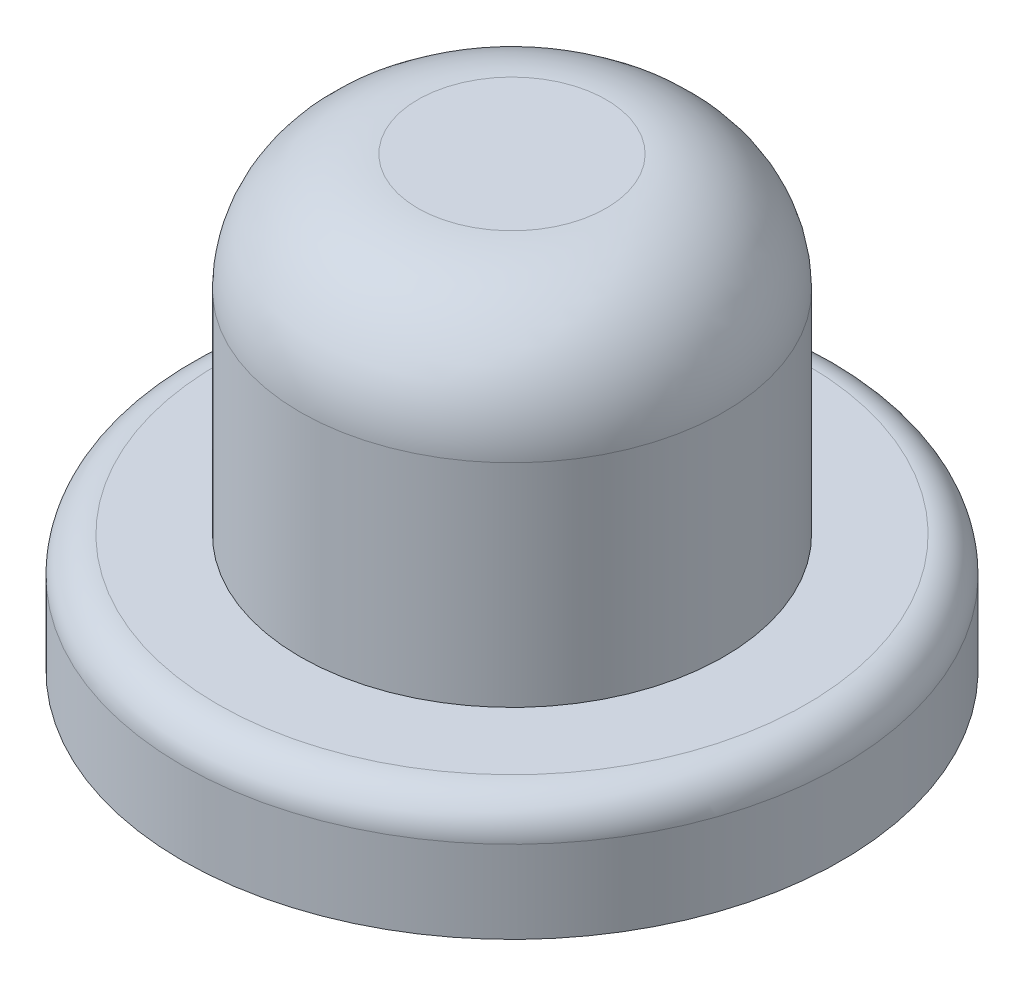
ISO-10303-21;
HEADER;
FILE_DESCRIPTION(('STEP AP214'),'2;1');
FILE_NAME('part.step','',(''),(''),'','','');
FILE_SCHEMA(('AUTOMOTIVE_DESIGN { 1 0 10303 214 1 1 1 1 }'));
ENDSEC;
DATA;
#1=APPLICATION_CONTEXT('core data for automotive mechanical design processes');
#2=APPLICATION_PROTOCOL_DEFINITION('international standard','automotive_design',2000,#1);
#3=PRODUCT_CONTEXT('',#1,'mechanical');
#4=PRODUCT('Part','Part','',(#3));
#5=PRODUCT_RELATED_PRODUCT_CATEGORY('part','',(#4));
#6=PRODUCT_DEFINITION_FORMATION('','',#4);
#7=PRODUCT_DEFINITION_CONTEXT('part definition',#1,'design');
#8=PRODUCT_DEFINITION('design','',#6,#7);
#9=PRODUCT_DEFINITION_SHAPE('','',#8);
#10=(LENGTH_UNIT() NAMED_UNIT(*) SI_UNIT(.MILLI.,.METRE.));
#11=(NAMED_UNIT(*) PLANE_ANGLE_UNIT() SI_UNIT($,.RADIAN.));
#12=(NAMED_UNIT(*) SI_UNIT($,.STERADIAN.) SOLID_ANGLE_UNIT());
#13=UNCERTAINTY_MEASURE_WITH_UNIT(LENGTH_MEASURE(1.E-05),#10,'distance_accuracy_value','');
#14=(GEOMETRIC_REPRESENTATION_CONTEXT(3) GLOBAL_UNCERTAINTY_ASSIGNED_CONTEXT((#13)) GLOBAL_UNIT_ASSIGNED_CONTEXT((#10,
#11,#12)) REPRESENTATION_CONTEXT('',''));
#15=CARTESIAN_POINT('',(0.,0.,0.));
#16=DIRECTION('',(0.,0.,1.));
#17=DIRECTION('',(1.,0.,0.));
#18=AXIS2_PLACEMENT_3D('',#15,#16,#17);
#19=CARTESIAN_POINT('',(0.,1.,0.));
#20=DIRECTION('',(0.,-1.,0.));
#21=DIRECTION('',(0.,0.,-1.));
#22=AXIS2_PLACEMENT_3D('',#19,#20,#21);
#23=CYLINDRICAL_SURFACE('',#22,2.8);
#24=CARTESIAN_POINT('',(0.,0.7,0.));
#25=DIRECTION('',(0.,1.,0.));
#26=DIRECTION('',(0.,0.,1.));
#27=AXIS2_PLACEMENT_3D('',#24,#25,#26);
#28=CIRCLE('',#27,2.8);
#29=CARTESIAN_POINT('',(0.,0.7,2.8));
#30=VERTEX_POINT('',#29);
#31=EDGE_CURVE('E10',#30,#30,#28,.F.);
#32=ORIENTED_EDGE('',*,*,#31,.T.);
#33=EDGE_LOOP('',(#32));
#34=FACE_BOUND('',#33,.T.);
#35=CARTESIAN_POINT('',(0.,0.,0.));
#36=DIRECTION('',(0.,1.,0.));
#37=DIRECTION('',(0.,0.,1.));
#38=AXIS2_PLACEMENT_3D('',#35,#36,#37);
#39=CIRCLE('',#38,2.8);
#40=CARTESIAN_POINT('',(0.,0.,2.8));
#41=VERTEX_POINT('',#40);
#42=EDGE_CURVE('E62',#41,#41,#39,.T.);
#43=ORIENTED_EDGE('',*,*,#42,.T.);
#44=EDGE_LOOP('',(#43));
#45=FACE_BOUND('',#44,.T.);
#46=ADVANCED_FACE('F37',(#34,#45),#23,.T.);
#47=CARTESIAN_POINT('',(0.,1.,0.));
#48=DIRECTION('',(0.,1.,0.));
#49=DIRECTION('',(0.,0.,1.));
#50=AXIS2_PLACEMENT_3D('',#47,#48,#49);
#51=PLANE('',#50);
#52=CARTESIAN_POINT('',(0.,1.,0.));
#53=DIRECTION('',(0.,1.,0.));
#54=DIRECTION('',(0.,0.,1.));
#55=AXIS2_PLACEMENT_3D('',#52,#53,#54);
#56=CIRCLE('',#55,2.5);
#57=CARTESIAN_POINT('',(0.,1.,2.5));
#58=VERTEX_POINT('',#57);
#59=EDGE_CURVE('E45',#58,#58,#56,.T.);
#60=ORIENTED_EDGE('',*,*,#59,.T.);
#61=EDGE_LOOP('',(#60));
#62=FACE_BOUND('',#61,.T.);
#63=CARTESIAN_POINT('',(0.,1.,0.));
#64=DIRECTION('',(0.,1.,0.));
#65=DIRECTION('',(0.,0.,1.));
#66=AXIS2_PLACEMENT_3D('',#63,#64,#65);
#67=CIRCLE('',#66,1.8);
#68=CARTESIAN_POINT('',(0.,1.,1.8));
#69=VERTEX_POINT('',#68);
#70=EDGE_CURVE('E61',#69,#69,#67,.T.);
#71=ORIENTED_EDGE('',*,*,#70,.F.);
#72=EDGE_LOOP('',(#71));
#73=FACE_BOUND('',#72,.T.);
#74=ADVANCED_FACE('F72',(#62,#73),#51,.T.);
#75=CARTESIAN_POINT('',(0.,0.,0.));
#76=DIRECTION('',(0.,1.,0.));
#77=DIRECTION('',(0.,0.,1.));
#78=AXIS2_PLACEMENT_3D('',#75,#76,#77);
#79=PLANE('',#78);
#80=ORIENTED_EDGE('',*,*,#42,.F.);
#81=EDGE_LOOP('',(#80));
#82=FACE_BOUND('',#81,.T.);
#83=ADVANCED_FACE('F74',(#82),#79,.F.);
#84=CARTESIAN_POINT('',(0.,3.8,0.));
#85=DIRECTION('',(0.,-1.,0.));
#86=DIRECTION('',(0.,0.,-1.));
#87=AXIS2_PLACEMENT_3D('',#84,#85,#86);
#88=CYLINDRICAL_SURFACE('',#87,1.8);
#89=CARTESIAN_POINT('',(0.,2.8,0.));
#90=DIRECTION('',(0.,1.,0.));
#91=DIRECTION('',(0.,0.,1.));
#92=AXIS2_PLACEMENT_3D('',#89,#90,#91);
#93=CIRCLE('',#92,1.8);
#94=CARTESIAN_POINT('',(0.,2.8,1.8));
#95=VERTEX_POINT('',#94);
#96=EDGE_CURVE('E50',#95,#95,#93,.F.);
#97=ORIENTED_EDGE('',*,*,#96,.T.);
#98=EDGE_LOOP('',(#97));
#99=FACE_BOUND('',#98,.T.);
#100=ORIENTED_EDGE('',*,*,#70,.T.);
#101=EDGE_LOOP('',(#100));
#102=FACE_BOUND('',#101,.T.);
#103=ADVANCED_FACE('F70',(#99,#102),#88,.T.);
#104=CARTESIAN_POINT('',(0.,3.8,0.));
#105=DIRECTION('',(0.,1.,0.));
#106=DIRECTION('',(0.,0.,1.));
#107=AXIS2_PLACEMENT_3D('',#104,#105,#106);
#108=PLANE('',#107);
#109=CARTESIAN_POINT('',(0.,3.8,0.));
#110=DIRECTION('',(0.,1.,0.));
#111=DIRECTION('',(0.,0.,1.));
#112=AXIS2_PLACEMENT_3D('',#109,#110,#111);
#113=CIRCLE('',#112,0.8);
#114=CARTESIAN_POINT('',(0.,3.8,0.8));
#115=VERTEX_POINT('',#114);
#116=EDGE_CURVE('E55',#115,#115,#113,.T.);
#117=ORIENTED_EDGE('',*,*,#116,.T.);
#118=EDGE_LOOP('',(#117));
#119=FACE_BOUND('',#118,.T.);
#120=ADVANCED_FACE('F87',(#119),#108,.T.);
#121=CARTESIAN_POINT('',(0.,2.8,0.));
#122=DIRECTION('',(0.,1.,0.));
#123=DIRECTION('',(0.,0.,1.));
#124=AXIS2_PLACEMENT_3D('',#121,#122,#123);
#125=DEGENERATE_TOROIDAL_SURFACE('',#124,0.8,1.,.T.);
#126=ORIENTED_EDGE('',*,*,#96,.F.);
#127=EDGE_LOOP('',(#126));
#128=FACE_BOUND('',#127,.T.);
#129=ORIENTED_EDGE('',*,*,#116,.F.);
#130=EDGE_LOOP('',(#129));
#131=FACE_BOUND('',#130,.T.);
#132=ADVANCED_FACE('F85',(#128,#131),#125,.T.);
#133=CARTESIAN_POINT('',(0.,0.7,0.));
#134=DIRECTION('',(0.,1.,0.));
#135=DIRECTION('',(0.,0.,1.));
#136=AXIS2_PLACEMENT_3D('',#133,#134,#135);
#137=TOROIDAL_SURFACE('',#136,2.5,0.3);
#138=ORIENTED_EDGE('',*,*,#31,.F.);
#139=EDGE_LOOP('',(#138));
#140=FACE_BOUND('',#139,.T.);
#141=ORIENTED_EDGE('',*,*,#59,.F.);
#142=EDGE_LOOP('',(#141));
#143=FACE_BOUND('',#142,.T.);
#144=ADVANCED_FACE('F39',(#140,#143),#137,.T.);
#145=CLOSED_SHELL('',(#46,#74,#83,#103,#120,#132,#144));
#146=MANIFOLD_SOLID_BREP('B2',#145);
#147=ADVANCED_BREP_SHAPE_REPRESENTATION('',(#18,#146),#14);
#148=SHAPE_DEFINITION_REPRESENTATION(#9,#147);
ENDSEC;
END-ISO-10303-21;
